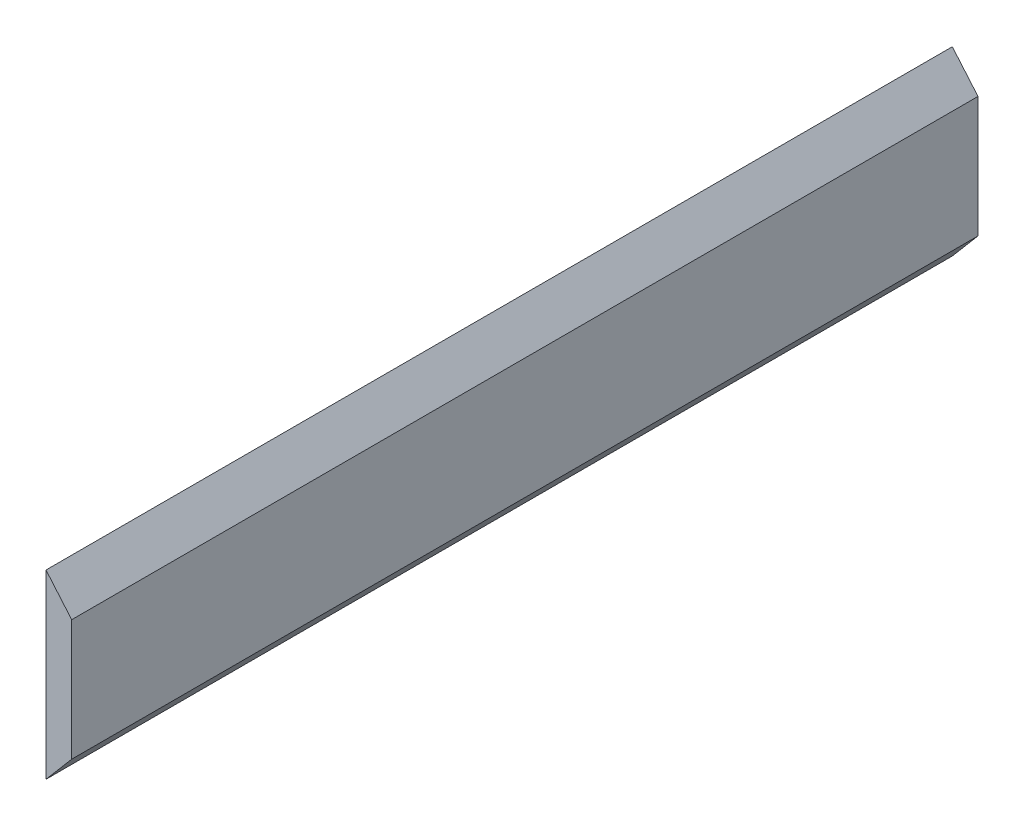
ISO-10303-21;
HEADER;
FILE_DESCRIPTION(('STEP AP214'),'2;1');
FILE_NAME('part.step','',(''),(''),'','','');
FILE_SCHEMA(('AUTOMOTIVE_DESIGN { 1 0 10303 214 1 1 1 1 }'));
ENDSEC;
DATA;
#1=APPLICATION_CONTEXT('core data for automotive mechanical design processes');
#2=APPLICATION_PROTOCOL_DEFINITION('international standard','automotive_design',2000,#1);
#3=PRODUCT_CONTEXT('',#1,'mechanical');
#4=PRODUCT('Part','Part','',(#3));
#5=PRODUCT_RELATED_PRODUCT_CATEGORY('part','',(#4));
#6=PRODUCT_DEFINITION_FORMATION('','',#4);
#7=PRODUCT_DEFINITION_CONTEXT('part definition',#1,'design');
#8=PRODUCT_DEFINITION('design','',#6,#7);
#9=PRODUCT_DEFINITION_SHAPE('','',#8);
#10=(LENGTH_UNIT() NAMED_UNIT(*) SI_UNIT(.MILLI.,.METRE.));
#11=(NAMED_UNIT(*) PLANE_ANGLE_UNIT() SI_UNIT($,.RADIAN.));
#12=(NAMED_UNIT(*) SI_UNIT($,.STERADIAN.) SOLID_ANGLE_UNIT());
#13=UNCERTAINTY_MEASURE_WITH_UNIT(LENGTH_MEASURE(1.E-05),#10,'distance_accuracy_value','');
#14=(GEOMETRIC_REPRESENTATION_CONTEXT(3) GLOBAL_UNCERTAINTY_ASSIGNED_CONTEXT((#13)) GLOBAL_UNIT_ASSIGNED_CONTEXT((#10,
#11,#12)) REPRESENTATION_CONTEXT('',''));
#15=CARTESIAN_POINT('',(0.,0.,0.));
#16=DIRECTION('',(0.,0.,1.));
#17=DIRECTION('',(1.,0.,0.));
#18=AXIS2_PLACEMENT_3D('',#15,#16,#17);
#19=CARTESIAN_POINT('',(0.,0.,0.));
#20=DIRECTION('',(0.,0.,-1.));
#21=DIRECTION('',(-1.,0.,0.));
#22=AXIS2_PLACEMENT_3D('',#19,#20,#21);
#23=PLANE('',#22);
#24=DIRECTION('',(0.,1.,0.));
#25=VECTOR('',#24,1.);
#26=CARTESIAN_POINT('',(-131.,165.,0.));
#27=LINE('',#26,#25);
#28=CARTESIAN_POINT('',(-131.,85.0000000000001,0.));
#29=VERTEX_POINT('',#28);
#30=CARTESIAN_POINT('',(-131.,165.,0.));
#31=VERTEX_POINT('',#30);
#32=EDGE_CURVE('E83',#29,#31,#27,.T.);
#33=ORIENTED_EDGE('',*,*,#32,.F.);
#34=DIRECTION('',(0.64764842009554,0.761939317759459,0.));
#35=VECTOR('',#34,1.);
#36=CARTESIAN_POINT('',(-131.,85.0000000000001,0.));
#37=LINE('',#36,#35);
#38=CARTESIAN_POINT('',(-148.,65.0000000000001,0.));
#39=VERTEX_POINT('',#38);
#40=EDGE_CURVE('E94',#39,#29,#37,.T.);
#41=ORIENTED_EDGE('',*,*,#40,.F.);
#42=DIRECTION('',(0.,-1.,0.));
#43=VECTOR('',#42,1.);
#44=CARTESIAN_POINT('',(-148.,65.0000000000001,0.));
#45=LINE('',#44,#43);
#46=CARTESIAN_POINT('',(-148.,185.,0.));
#47=VERTEX_POINT('',#46);
#48=EDGE_CURVE('E85',#47,#39,#45,.T.);
#49=ORIENTED_EDGE('',*,*,#48,.F.);
#50=DIRECTION('',(-0.64764842009554,0.761939317759459,0.));
#51=VECTOR('',#50,1.);
#52=CARTESIAN_POINT('',(-148.,185.,0.));
#53=LINE('',#52,#51);
#54=EDGE_CURVE('E75',#31,#47,#53,.T.);
#55=ORIENTED_EDGE('',*,*,#54,.F.);
#56=EDGE_LOOP('',(#33,#41,#49,#55));
#57=FACE_BOUND('',#56,.T.);
#58=ADVANCED_FACE('F33',(#57),#23,.T.);
#59=CARTESIAN_POINT('',(-131.,85.0000000000001,721.198184804889));
#60=DIRECTION('',(-0.761939317759459,0.64764842009554,0.));
#61=DIRECTION('',(-0.64764842009554,-0.761939317759459,0.));
#62=AXIS2_PLACEMENT_3D('',#59,#60,#61);
#63=PLANE('',#62);
#64=DIRECTION('',(0.,0.,-1.));
#65=VECTOR('',#64,1.);
#66=CARTESIAN_POINT('',(-131.,85.0000000000001,721.198184804889));
#67=LINE('',#66,#65);
#68=CARTESIAN_POINT('',(-131.,85.0000000000001,600.));
#69=VERTEX_POINT('',#68);
#70=EDGE_CURVE('E88',#69,#29,#67,.T.);
#71=ORIENTED_EDGE('',*,*,#70,.F.);
#72=DIRECTION('',(-0.64764842009554,-0.761939317759459,0.));
#73=VECTOR('',#72,1.);
#74=CARTESIAN_POINT('',(-131.,85.0000000000001,600.));
#75=LINE('',#74,#73);
#76=CARTESIAN_POINT('',(-148.,65.0000000000001,600.));
#77=VERTEX_POINT('',#76);
#78=EDGE_CURVE('E37',#69,#77,#75,.T.);
#79=ORIENTED_EDGE('',*,*,#78,.T.);
#80=DIRECTION('',(0.,0.,-1.));
#81=VECTOR('',#80,1.);
#82=CARTESIAN_POINT('',(-148.,65.0000000000001,721.198184804889));
#83=LINE('',#82,#81);
#84=EDGE_CURVE('E97',#77,#39,#83,.T.);
#85=ORIENTED_EDGE('',*,*,#84,.T.);
#86=ORIENTED_EDGE('',*,*,#40,.T.);
#87=EDGE_LOOP('',(#71,#79,#85,#86));
#88=FACE_BOUND('',#87,.T.);
#89=ADVANCED_FACE('F106',(#88),#63,.F.);
#90=CARTESIAN_POINT('',(-148.,65.0000000000001,721.198184804889));
#91=DIRECTION('',(1.,0.,0.));
#92=DIRECTION('',(0.,0.,-1.));
#93=AXIS2_PLACEMENT_3D('',#90,#91,#92);
#94=PLANE('',#93);
#95=ORIENTED_EDGE('',*,*,#84,.F.);
#96=DIRECTION('',(0.,1.,0.));
#97=VECTOR('',#96,1.);
#98=CARTESIAN_POINT('',(-148.,65.0000000000001,600.));
#99=LINE('',#98,#97);
#100=CARTESIAN_POINT('',(-148.,185.,600.));
#101=VERTEX_POINT('',#100);
#102=EDGE_CURVE('E103',#77,#101,#99,.T.);
#103=ORIENTED_EDGE('',*,*,#102,.T.);
#104=DIRECTION('',(0.,0.,-1.));
#105=VECTOR('',#104,1.);
#106=CARTESIAN_POINT('',(-148.,185.,721.198184804889));
#107=LINE('',#106,#105);
#108=EDGE_CURVE('E79',#101,#47,#107,.T.);
#109=ORIENTED_EDGE('',*,*,#108,.T.);
#110=ORIENTED_EDGE('',*,*,#48,.T.);
#111=EDGE_LOOP('',(#95,#103,#109,#110));
#112=FACE_BOUND('',#111,.T.);
#113=ADVANCED_FACE('F102',(#112),#94,.F.);
#114=CARTESIAN_POINT('',(-148.,185.,721.198184804889));
#115=DIRECTION('',(-0.761939317759459,-0.64764842009554,0.));
#116=DIRECTION('',(0.64764842009554,-0.761939317759459,0.));
#117=AXIS2_PLACEMENT_3D('',#114,#115,#116);
#118=PLANE('',#117);
#119=ORIENTED_EDGE('',*,*,#108,.F.);
#120=DIRECTION('',(0.64764842009554,-0.761939317759459,0.));
#121=VECTOR('',#120,1.);
#122=CARTESIAN_POINT('',(-148.,185.,600.));
#123=LINE('',#122,#121);
#124=CARTESIAN_POINT('',(-131.,165.,600.));
#125=VERTEX_POINT('',#124);
#126=EDGE_CURVE('E42',#101,#125,#123,.T.);
#127=ORIENTED_EDGE('',*,*,#126,.T.);
#128=DIRECTION('',(0.,0.,-1.));
#129=VECTOR('',#128,1.);
#130=CARTESIAN_POINT('',(-131.,165.,721.198184804889));
#131=LINE('',#130,#129);
#132=EDGE_CURVE('E72',#125,#31,#131,.T.);
#133=ORIENTED_EDGE('',*,*,#132,.T.);
#134=ORIENTED_EDGE('',*,*,#54,.T.);
#135=EDGE_LOOP('',(#119,#127,#133,#134));
#136=FACE_BOUND('',#135,.T.);
#137=ADVANCED_FACE('F74',(#136),#118,.F.);
#138=CARTESIAN_POINT('',(-131.,165.,721.198184804889));
#139=DIRECTION('',(-1.,0.,0.));
#140=DIRECTION('',(0.,0.,1.));
#141=AXIS2_PLACEMENT_3D('',#138,#139,#140);
#142=PLANE('',#141);
#143=ORIENTED_EDGE('',*,*,#132,.F.);
#144=DIRECTION('',(0.,-1.,0.));
#145=VECTOR('',#144,1.);
#146=CARTESIAN_POINT('',(-131.,165.,600.));
#147=LINE('',#146,#145);
#148=EDGE_CURVE('E11',#125,#69,#147,.T.);
#149=ORIENTED_EDGE('',*,*,#148,.T.);
#150=ORIENTED_EDGE('',*,*,#70,.T.);
#151=ORIENTED_EDGE('',*,*,#32,.T.);
#152=EDGE_LOOP('',(#143,#149,#150,#151));
#153=FACE_BOUND('',#152,.T.);
#154=ADVANCED_FACE('F35',(#153),#142,.F.);
#155=CARTESIAN_POINT('',(-226.,250.,600.));
#156=DIRECTION('',(0.,0.,-1.));
#157=DIRECTION('',(-1.,0.,0.));
#158=AXIS2_PLACEMENT_3D('',#155,#156,#157);
#159=PLANE('',#158);
#160=ORIENTED_EDGE('',*,*,#126,.F.);
#161=ORIENTED_EDGE('',*,*,#102,.F.);
#162=ORIENTED_EDGE('',*,*,#78,.F.);
#163=ORIENTED_EDGE('',*,*,#148,.F.);
#164=EDGE_LOOP('',(#160,#161,#162,#163));
#165=FACE_BOUND('',#164,.T.);
#166=ADVANCED_FACE('F120',(#165),#159,.F.);
#167=CLOSED_SHELL('',(#58,#89,#113,#137,#154,#166));
#168=MANIFOLD_SOLID_BREP('B2',#167);
#169=ADVANCED_BREP_SHAPE_REPRESENTATION('',(#18,#168),#14);
#170=SHAPE_DEFINITION_REPRESENTATION(#9,#169);
ENDSEC;
END-ISO-10303-21;
